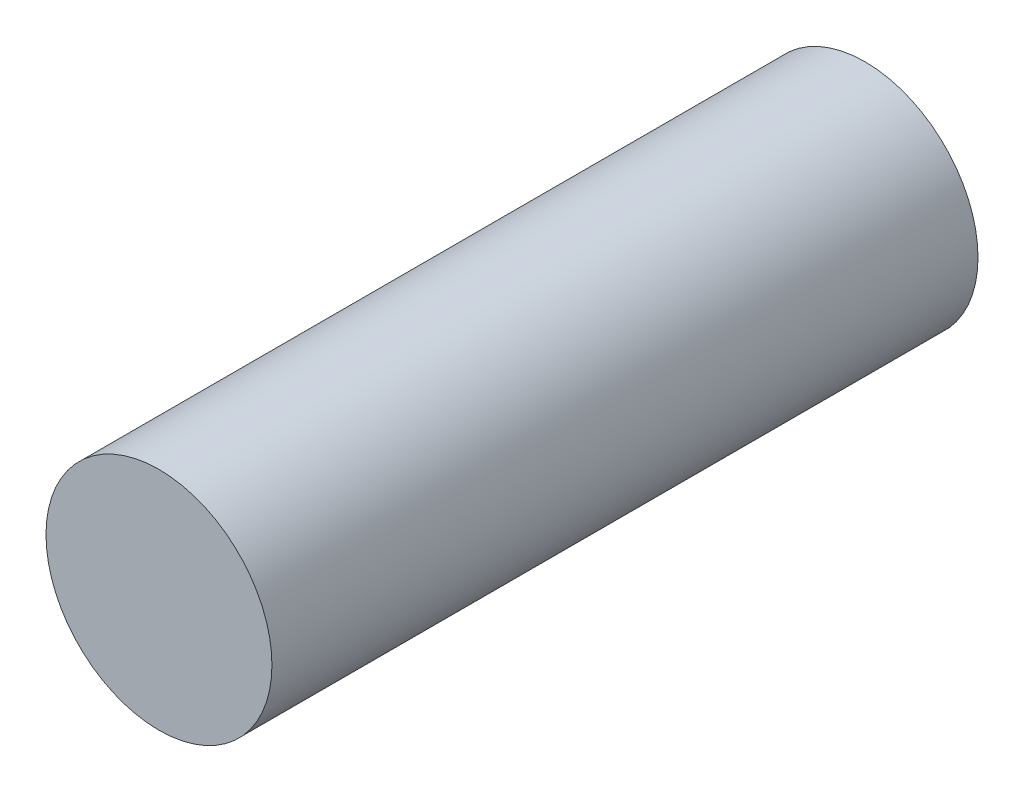
ISO-10303-21;
HEADER;
FILE_DESCRIPTION(('STEP AP214'),'2;1');
FILE_NAME('part.step','',(''),(''),'','','');
FILE_SCHEMA(('AUTOMOTIVE_DESIGN { 1 0 10303 214 1 1 1 1 }'));
ENDSEC;
DATA;
#1=APPLICATION_CONTEXT('core data for automotive mechanical design processes');
#2=APPLICATION_PROTOCOL_DEFINITION('international standard','automotive_design',2000,#1);
#3=PRODUCT_CONTEXT('',#1,'mechanical');
#4=PRODUCT('Part','Part','',(#3));
#5=PRODUCT_RELATED_PRODUCT_CATEGORY('part','',(#4));
#6=PRODUCT_DEFINITION_FORMATION('','',#4);
#7=PRODUCT_DEFINITION_CONTEXT('part definition',#1,'design');
#8=PRODUCT_DEFINITION('design','',#6,#7);
#9=PRODUCT_DEFINITION_SHAPE('','',#8);
#10=(LENGTH_UNIT() NAMED_UNIT(*) SI_UNIT(.MILLI.,.METRE.));
#11=(NAMED_UNIT(*) PLANE_ANGLE_UNIT() SI_UNIT($,.RADIAN.));
#12=(NAMED_UNIT(*) SI_UNIT($,.STERADIAN.) SOLID_ANGLE_UNIT());
#13=UNCERTAINTY_MEASURE_WITH_UNIT(LENGTH_MEASURE(1.E-05),#10,'distance_accuracy_value','');
#14=(GEOMETRIC_REPRESENTATION_CONTEXT(3) GLOBAL_UNCERTAINTY_ASSIGNED_CONTEXT((#13)) GLOBAL_UNIT_ASSIGNED_CONTEXT((#10,
#11,#12)) REPRESENTATION_CONTEXT('',''));
#15=CARTESIAN_POINT('',(0.,0.,0.));
#16=DIRECTION('',(0.,0.,1.));
#17=DIRECTION('',(1.,0.,0.));
#18=AXIS2_PLACEMENT_3D('',#15,#16,#17);
#19=CARTESIAN_POINT('',(0.,0.,25.));
#20=DIRECTION('',(0.,0.,-1.));
#21=DIRECTION('',(-1.,0.,0.));
#22=AXIS2_PLACEMENT_3D('',#19,#20,#21);
#23=CYLINDRICAL_SURFACE('',#22,4.);
#24=CARTESIAN_POINT('',(0.,0.,25.));
#25=DIRECTION('',(0.,0.,1.));
#26=DIRECTION('',(1.,0.,0.));
#27=AXIS2_PLACEMENT_3D('',#24,#25,#26);
#28=CIRCLE('',#27,4.);
#29=CARTESIAN_POINT('',(4.,0.,25.));
#30=VERTEX_POINT('',#29);
#31=EDGE_CURVE('E10',#30,#30,#28,.T.);
#32=ORIENTED_EDGE('',*,*,#31,.F.);
#33=EDGE_LOOP('',(#32));
#34=FACE_BOUND('',#33,.T.);
#35=CARTESIAN_POINT('',(0.,0.,0.));
#36=DIRECTION('',(0.,0.,1.));
#37=DIRECTION('',(1.,0.,0.));
#38=AXIS2_PLACEMENT_3D('',#35,#36,#37);
#39=CIRCLE('',#38,4.);
#40=CARTESIAN_POINT('',(4.,0.,0.));
#41=VERTEX_POINT('',#40);
#42=EDGE_CURVE('E44',#41,#41,#39,.T.);
#43=ORIENTED_EDGE('',*,*,#42,.T.);
#44=EDGE_LOOP('',(#43));
#45=FACE_BOUND('',#44,.T.);
#46=ADVANCED_FACE('F41',(#34,#45),#23,.T.);
#47=CARTESIAN_POINT('',(0.,0.,25.));
#48=DIRECTION('',(0.,0.,1.));
#49=DIRECTION('',(1.,0.,0.));
#50=AXIS2_PLACEMENT_3D('',#47,#48,#49);
#51=PLANE('',#50);
#52=ORIENTED_EDGE('',*,*,#31,.T.);
#53=EDGE_LOOP('',(#52));
#54=FACE_BOUND('',#53,.T.);
#55=ADVANCED_FACE('F58',(#54),#51,.T.);
#56=CARTESIAN_POINT('',(0.,0.,0.));
#57=DIRECTION('',(0.,0.,1.));
#58=DIRECTION('',(1.,0.,0.));
#59=AXIS2_PLACEMENT_3D('',#56,#57,#58);
#60=PLANE('',#59);
#61=ORIENTED_EDGE('',*,*,#42,.F.);
#62=EDGE_LOOP('',(#61));
#63=FACE_BOUND('',#62,.T.);
#64=ADVANCED_FACE('F56',(#63),#60,.F.);
#65=CLOSED_SHELL('',(#46,#55,#64));
#66=MANIFOLD_SOLID_BREP('B2',#65);
#67=ADVANCED_BREP_SHAPE_REPRESENTATION('',(#18,#66),#14);
#68=SHAPE_DEFINITION_REPRESENTATION(#9,#67);
ENDSEC;
END-ISO-10303-21;
